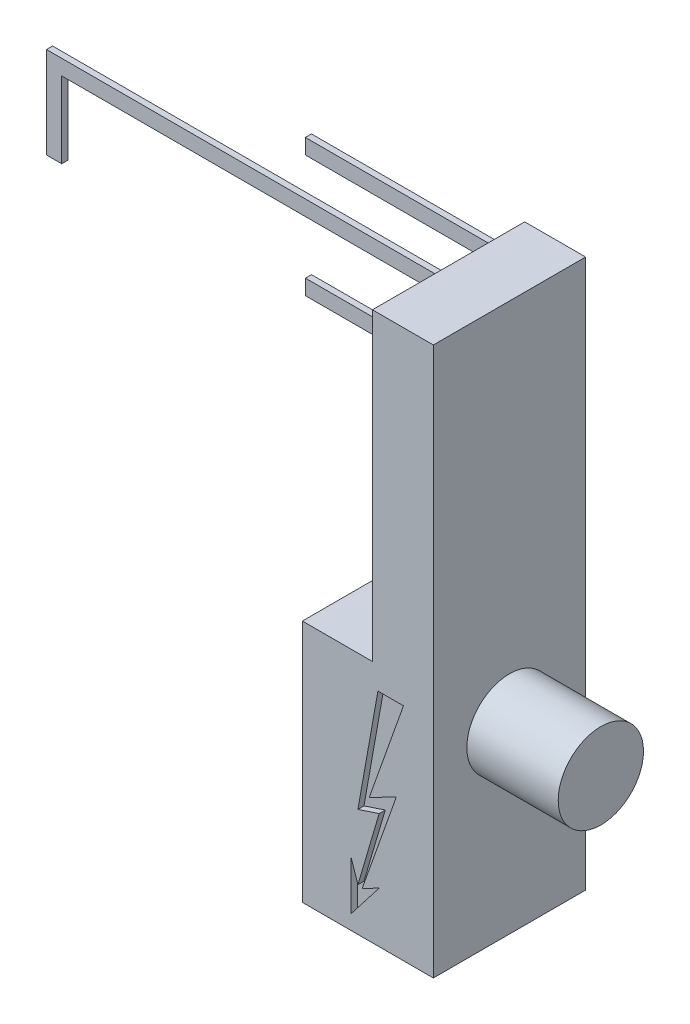
ISO-10303-21;
HEADER;
FILE_DESCRIPTION(('STEP AP214'),'2;1');
FILE_NAME('part.step','',(''),(''),'','','');
FILE_SCHEMA(('AUTOMOTIVE_DESIGN { 1 0 10303 214 1 1 1 1 }'));
ENDSEC;
DATA;
#1=APPLICATION_CONTEXT('core data for automotive mechanical design processes');
#2=APPLICATION_PROTOCOL_DEFINITION('international standard','automotive_design',2000,#1);
#3=PRODUCT_CONTEXT('',#1,'mechanical');
#4=PRODUCT('Part','Part','',(#3));
#5=PRODUCT_RELATED_PRODUCT_CATEGORY('part','',(#4));
#6=PRODUCT_DEFINITION_FORMATION('','',#4);
#7=PRODUCT_DEFINITION_CONTEXT('part definition',#1,'design');
#8=PRODUCT_DEFINITION('design','',#6,#7);
#9=PRODUCT_DEFINITION_SHAPE('','',#8);
#10=(LENGTH_UNIT() NAMED_UNIT(*) SI_UNIT(.MILLI.,.METRE.));
#11=(NAMED_UNIT(*) PLANE_ANGLE_UNIT() SI_UNIT($,.RADIAN.));
#12=(NAMED_UNIT(*) SI_UNIT($,.STERADIAN.) SOLID_ANGLE_UNIT());
#13=UNCERTAINTY_MEASURE_WITH_UNIT(LENGTH_MEASURE(1.E-05),#10,'distance_accuracy_value','');
#14=(GEOMETRIC_REPRESENTATION_CONTEXT(3) GLOBAL_UNCERTAINTY_ASSIGNED_CONTEXT((#13)) GLOBAL_UNIT_ASSIGNED_CONTEXT((#10,
#11,#12)) REPRESENTATION_CONTEXT('',''));
#15=CARTESIAN_POINT('',(0.,0.,0.));
#16=DIRECTION('',(0.,0.,1.));
#17=DIRECTION('',(1.,0.,0.));
#18=AXIS2_PLACEMENT_3D('',#15,#16,#17);
#19=CARTESIAN_POINT('',(-3.5,31.25,-11.5));
#20=DIRECTION('',(1.,0.,0.));
#21=DIRECTION('',(0.,1.,0.));
#22=AXIS2_PLACEMENT_3D('',#19,#20,#21);
#23=PLANE('',#22);
#24=DIRECTION('',(0.,-1.,0.));
#25=VECTOR('',#24,1.);
#26=CARTESIAN_POINT('',(-3.5,31.25,-12.5));
#27=LINE('',#26,#25);
#28=CARTESIAN_POINT('',(-3.5,31.25,-12.5));
#29=VERTEX_POINT('',#28);
#30=CARTESIAN_POINT('',(-3.5,28.75,-12.5));
#31=VERTEX_POINT('',#30);
#32=EDGE_CURVE('E135',#29,#31,#27,.T.);
#33=ORIENTED_EDGE('',*,*,#32,.F.);
#34=DIRECTION('',(0.,0.,-1.));
#35=VECTOR('',#34,1.);
#36=CARTESIAN_POINT('',(-3.5,31.25,-11.5));
#37=LINE('',#36,#35);
#38=CARTESIAN_POINT('',(-3.5,31.25,-11.5));
#39=VERTEX_POINT('',#38);
#40=EDGE_CURVE('E12',#39,#29,#37,.T.);
#41=ORIENTED_EDGE('',*,*,#40,.F.);
#42=DIRECTION('',(0.,-1.,0.));
#43=VECTOR('',#42,1.);
#44=CARTESIAN_POINT('',(-3.5,31.25,-11.5));
#45=LINE('',#44,#43);
#46=CARTESIAN_POINT('',(-3.5,28.75,-11.5));
#47=VERTEX_POINT('',#46);
#48=EDGE_CURVE('E147',#39,#47,#45,.T.);
#49=ORIENTED_EDGE('',*,*,#48,.T.);
#50=DIRECTION('',(0.,0.,-1.));
#51=VECTOR('',#50,1.);
#52=CARTESIAN_POINT('',(-3.5,28.75,-11.5));
#53=LINE('',#52,#51);
#54=EDGE_CURVE('E53',#47,#31,#53,.T.);
#55=ORIENTED_EDGE('',*,*,#54,.T.);
#56=EDGE_LOOP('',(#33,#41,#49,#55));
#57=FACE_BOUND('',#56,.T.);
#58=ADVANCED_FACE('F50',(#57),#23,.T.);
#59=CARTESIAN_POINT('',(-3.5,31.25,-11.5));
#60=DIRECTION('',(0.,1.,0.));
#61=DIRECTION('',(0.,0.,1.));
#62=AXIS2_PLACEMENT_3D('',#59,#60,#61);
#63=PLANE('',#62);
#64=DIRECTION('',(1.,0.,0.));
#65=VECTOR('',#64,1.);
#66=CARTESIAN_POINT('',(-3.5,31.25,-12.5));
#67=LINE('',#66,#65);
#68=CARTESIAN_POINT('',(-81.,31.25,-12.5));
#69=VERTEX_POINT('',#68);
#70=EDGE_CURVE('E87',#69,#29,#67,.T.);
#71=ORIENTED_EDGE('',*,*,#70,.F.);
#72=DIRECTION('',(0.,0.,-1.));
#73=VECTOR('',#72,1.);
#74=CARTESIAN_POINT('',(-81.,31.25,-11.5));
#75=LINE('',#74,#73);
#76=CARTESIAN_POINT('',(-81.,31.25,-11.5));
#77=VERTEX_POINT('',#76);
#78=EDGE_CURVE('E59',#77,#69,#75,.T.);
#79=ORIENTED_EDGE('',*,*,#78,.F.);
#80=DIRECTION('',(1.,0.,0.));
#81=VECTOR('',#80,1.);
#82=CARTESIAN_POINT('',(-78.5,31.25,-11.5));
#83=LINE('',#82,#81);
#84=EDGE_CURVE('E67',#77,#39,#83,.T.);
#85=ORIENTED_EDGE('',*,*,#84,.T.);
#86=ORIENTED_EDGE('',*,*,#40,.T.);
#87=EDGE_LOOP('',(#71,#79,#85,#86));
#88=FACE_BOUND('',#87,.T.);
#89=ADVANCED_FACE('F168',(#88),#63,.T.);
#90=CARTESIAN_POINT('',(-81.,31.25,-11.5));
#91=DIRECTION('',(-1.,0.,0.));
#92=DIRECTION('',(0.,0.,1.));
#93=AXIS2_PLACEMENT_3D('',#90,#91,#92);
#94=PLANE('',#93);
#95=DIRECTION('',(0.,1.,0.));
#96=VECTOR('',#95,1.);
#97=CARTESIAN_POINT('',(-81.,31.25,-12.5));
#98=LINE('',#97,#96);
#99=CARTESIAN_POINT('',(-81.,16.25,-12.5));
#100=VERTEX_POINT('',#99);
#101=EDGE_CURVE('E112',#100,#69,#98,.T.);
#102=ORIENTED_EDGE('',*,*,#101,.F.);
#103=DIRECTION('',(0.,0.,-1.));
#104=VECTOR('',#103,1.);
#105=CARTESIAN_POINT('',(-81.,16.25,-11.5));
#106=LINE('',#105,#104);
#107=CARTESIAN_POINT('',(-81.,16.25,-11.5));
#108=VERTEX_POINT('',#107);
#109=EDGE_CURVE('E107',#108,#100,#106,.T.);
#110=ORIENTED_EDGE('',*,*,#109,.F.);
#111=DIRECTION('',(0.,1.,0.));
#112=VECTOR('',#111,1.);
#113=CARTESIAN_POINT('',(-81.,31.25,-11.5));
#114=LINE('',#113,#112);
#115=EDGE_CURVE('E110',#108,#77,#114,.T.);
#116=ORIENTED_EDGE('',*,*,#115,.T.);
#117=ORIENTED_EDGE('',*,*,#78,.T.);
#118=EDGE_LOOP('',(#102,#110,#116,#117));
#119=FACE_BOUND('',#118,.T.);
#120=ADVANCED_FACE('F109',(#119),#94,.T.);
#121=CARTESIAN_POINT('',(-78.5,16.25,-11.5));
#122=DIRECTION('',(0.,-1.,0.));
#123=DIRECTION('',(0.,0.,-1.));
#124=AXIS2_PLACEMENT_3D('',#121,#122,#123);
#125=PLANE('',#124);
#126=DIRECTION('',(-1.,0.,0.));
#127=VECTOR('',#126,1.);
#128=CARTESIAN_POINT('',(-78.5,16.25,-12.5));
#129=LINE('',#128,#127);
#130=CARTESIAN_POINT('',(-78.5,16.25,-12.5));
#131=VERTEX_POINT('',#130);
#132=EDGE_CURVE('E144',#131,#100,#129,.T.);
#133=ORIENTED_EDGE('',*,*,#132,.F.);
#134=DIRECTION('',(0.,0.,-1.));
#135=VECTOR('',#134,1.);
#136=CARTESIAN_POINT('',(-78.5,16.25,-11.5));
#137=LINE('',#136,#135);
#138=CARTESIAN_POINT('',(-78.5,16.25,-11.5));
#139=VERTEX_POINT('',#138);
#140=EDGE_CURVE('E117',#139,#131,#137,.T.);
#141=ORIENTED_EDGE('',*,*,#140,.F.);
#142=DIRECTION('',(-1.,0.,0.));
#143=VECTOR('',#142,1.);
#144=CARTESIAN_POINT('',(-78.5,16.25,-11.5));
#145=LINE('',#144,#143);
#146=EDGE_CURVE('E124',#139,#108,#145,.T.);
#147=ORIENTED_EDGE('',*,*,#146,.T.);
#148=ORIENTED_EDGE('',*,*,#109,.T.);
#149=EDGE_LOOP('',(#133,#141,#147,#148));
#150=FACE_BOUND('',#149,.T.);
#151=ADVANCED_FACE('F127',(#150),#125,.T.);
#152=CARTESIAN_POINT('',(-78.5,28.75,-11.5));
#153=DIRECTION('',(1.,0.,0.));
#154=DIRECTION('',(0.,0.,-1.));
#155=AXIS2_PLACEMENT_3D('',#152,#153,#154);
#156=PLANE('',#155);
#157=DIRECTION('',(0.,-1.,0.));
#158=VECTOR('',#157,1.);
#159=CARTESIAN_POINT('',(-78.5,28.75,-12.5));
#160=LINE('',#159,#158);
#161=CARTESIAN_POINT('',(-78.5,28.75,-12.5));
#162=VERTEX_POINT('',#161);
#163=EDGE_CURVE('E141',#162,#131,#160,.T.);
#164=ORIENTED_EDGE('',*,*,#163,.F.);
#165=DIRECTION('',(0.,0.,-1.));
#166=VECTOR('',#165,1.);
#167=CARTESIAN_POINT('',(-78.5,28.75,-11.5));
#168=LINE('',#167,#166);
#169=CARTESIAN_POINT('',(-78.5,28.75,-11.5));
#170=VERTEX_POINT('',#169);
#171=EDGE_CURVE('E150',#170,#162,#168,.T.);
#172=ORIENTED_EDGE('',*,*,#171,.F.);
#173=DIRECTION('',(0.,-1.,0.));
#174=VECTOR('',#173,1.);
#175=CARTESIAN_POINT('',(-78.5,28.75,-11.5));
#176=LINE('',#175,#174);
#177=EDGE_CURVE('E128',#170,#139,#176,.T.);
#178=ORIENTED_EDGE('',*,*,#177,.T.);
#179=ORIENTED_EDGE('',*,*,#140,.T.);
#180=EDGE_LOOP('',(#164,#172,#178,#179));
#181=FACE_BOUND('',#180,.T.);
#182=ADVANCED_FACE('F158',(#181),#156,.T.);
#183=CARTESIAN_POINT('',(-3.5,28.75,-11.5));
#184=DIRECTION('',(0.,-1.,0.));
#185=DIRECTION('',(0.,0.,-1.));
#186=AXIS2_PLACEMENT_3D('',#183,#184,#185);
#187=PLANE('',#186);
#188=DIRECTION('',(-1.,0.,0.));
#189=VECTOR('',#188,1.);
#190=CARTESIAN_POINT('',(-3.5,28.75,-12.5));
#191=LINE('',#190,#189);
#192=EDGE_CURVE('E138',#31,#162,#191,.T.);
#193=ORIENTED_EDGE('',*,*,#192,.F.);
#194=ORIENTED_EDGE('',*,*,#54,.F.);
#195=DIRECTION('',(-1.,0.,0.));
#196=VECTOR('',#195,1.);
#197=CARTESIAN_POINT('',(-3.5,28.75,-11.5));
#198=LINE('',#197,#196);
#199=EDGE_CURVE('E130',#47,#170,#198,.T.);
#200=ORIENTED_EDGE('',*,*,#199,.T.);
#201=ORIENTED_EDGE('',*,*,#171,.T.);
#202=EDGE_LOOP('',(#193,#194,#200,#201));
#203=FACE_BOUND('',#202,.T.);
#204=ADVANCED_FACE('F154',(#203),#187,.T.);
#205=CARTESIAN_POINT('',(0.,0.,-11.5));
#206=DIRECTION('',(0.,0.,-1.));
#207=DIRECTION('',(-1.,0.,0.));
#208=AXIS2_PLACEMENT_3D('',#205,#206,#207);
#209=PLANE('',#208);
#210=ORIENTED_EDGE('',*,*,#48,.F.);
#211=ORIENTED_EDGE('',*,*,#84,.F.);
#212=ORIENTED_EDGE('',*,*,#115,.F.);
#213=ORIENTED_EDGE('',*,*,#146,.F.);
#214=ORIENTED_EDGE('',*,*,#177,.F.);
#215=ORIENTED_EDGE('',*,*,#199,.F.);
#216=EDGE_LOOP('',(#210,#211,#212,#213,#214,#215));
#217=FACE_BOUND('',#216,.T.);
#218=ADVANCED_FACE('F122',(#217),#209,.F.);
#219=CARTESIAN_POINT('',(0.,0.,-12.5));
#220=DIRECTION('',(0.,0.,-1.));
#221=DIRECTION('',(-1.,0.,0.));
#222=AXIS2_PLACEMENT_3D('',#219,#220,#221);
#223=PLANE('',#222);
#224=ORIENTED_EDGE('',*,*,#32,.T.);
#225=ORIENTED_EDGE('',*,*,#192,.T.);
#226=ORIENTED_EDGE('',*,*,#163,.T.);
#227=ORIENTED_EDGE('',*,*,#132,.T.);
#228=ORIENTED_EDGE('',*,*,#101,.T.);
#229=ORIENTED_EDGE('',*,*,#70,.T.);
#230=EDGE_LOOP('',(#224,#225,#226,#227,#228,#229));
#231=FACE_BOUND('',#230,.T.);
#232=ADVANCED_FACE('F156',(#231),#223,.T.);
#233=CLOSED_SHELL('',(#58,#89,#120,#151,#182,#204,#218,#232));
#234=MANIFOLD_SOLID_BREP('B2',#233);
#235=CARTESIAN_POINT('',(-3.5,17.5,-11.5));
#236=DIRECTION('',(1.,0.,0.));
#237=DIRECTION('',(0.,1.,0.));
#238=AXIS2_PLACEMENT_3D('',#235,#236,#237);
#239=PLANE('',#238);
#240=DIRECTION('',(0.,-1.,0.));
#241=VECTOR('',#240,1.);
#242=CARTESIAN_POINT('',(-3.5,17.5,-12.5));
#243=LINE('',#242,#241);
#244=CARTESIAN_POINT('',(-3.5,20.,-12.5));
#245=VERTEX_POINT('',#244);
#246=CARTESIAN_POINT('',(-3.5,17.5,-12.5));
#247=VERTEX_POINT('',#246);
#248=EDGE_CURVE('E303',#245,#247,#243,.T.);
#249=ORIENTED_EDGE('',*,*,#248,.F.);
#250=DIRECTION('',(0.,0.,-1.));
#251=VECTOR('',#250,1.);
#252=CARTESIAN_POINT('',(-3.5,20.,-11.5));
#253=LINE('',#252,#251);
#254=CARTESIAN_POINT('',(-3.5,20.,-11.5));
#255=VERTEX_POINT('',#254);
#256=EDGE_CURVE('E48',#255,#245,#253,.T.);
#257=ORIENTED_EDGE('',*,*,#256,.F.);
#258=DIRECTION('',(0.,-1.,0.));
#259=VECTOR('',#258,1.);
#260=CARTESIAN_POINT('',(-3.5,17.5,-11.5));
#261=LINE('',#260,#259);
#262=CARTESIAN_POINT('',(-3.5,17.5,-11.5));
#263=VERTEX_POINT('',#262);
#264=EDGE_CURVE('E297',#255,#263,#261,.T.);
#265=ORIENTED_EDGE('',*,*,#264,.T.);
#266=DIRECTION('',(0.,0.,-1.));
#267=VECTOR('',#266,1.);
#268=CARTESIAN_POINT('',(-3.5,17.5,-11.5));
#269=LINE('',#268,#267);
#270=EDGE_CURVE('E242',#263,#247,#269,.T.);
#271=ORIENTED_EDGE('',*,*,#270,.T.);
#272=EDGE_LOOP('',(#249,#257,#265,#271));
#273=FACE_BOUND('',#272,.T.);
#274=ADVANCED_FACE('F239',(#273),#239,.T.);
#275=CARTESIAN_POINT('',(-3.5,20.,-11.5));
#276=DIRECTION('',(0.,1.,0.));
#277=DIRECTION('',(-1.,0.,0.));
#278=AXIS2_PLACEMENT_3D('',#275,#276,#277);
#279=PLANE('',#278);
#280=DIRECTION('',(1.,0.,0.));
#281=VECTOR('',#280,1.);
#282=CARTESIAN_POINT('',(-3.5,20.,-12.5));
#283=LINE('',#282,#281);
#284=CARTESIAN_POINT('',(-38.5,20.,-12.5));
#285=VERTEX_POINT('',#284);
#286=EDGE_CURVE('E299',#285,#245,#283,.T.);
#287=ORIENTED_EDGE('',*,*,#286,.F.);
#288=DIRECTION('',(0.,0.,-1.));
#289=VECTOR('',#288,1.);
#290=CARTESIAN_POINT('',(-38.5,20.,-11.5));
#291=LINE('',#290,#289);
#292=CARTESIAN_POINT('',(-38.5,20.,-11.5));
#293=VERTEX_POINT('',#292);
#294=EDGE_CURVE('E248',#293,#285,#291,.T.);
#295=ORIENTED_EDGE('',*,*,#294,.F.);
#296=DIRECTION('',(1.,0.,0.));
#297=VECTOR('',#296,1.);
#298=CARTESIAN_POINT('',(-3.5,20.,-11.5));
#299=LINE('',#298,#297);
#300=EDGE_CURVE('E294',#293,#255,#299,.T.);
#301=ORIENTED_EDGE('',*,*,#300,.T.);
#302=ORIENTED_EDGE('',*,*,#256,.T.);
#303=EDGE_LOOP('',(#287,#295,#301,#302));
#304=FACE_BOUND('',#303,.T.);
#305=ADVANCED_FACE('F313',(#304),#279,.T.);
#306=CARTESIAN_POINT('',(-38.5,20.,-11.5));
#307=DIRECTION('',(-1.,0.,0.));
#308=DIRECTION('',(0.,0.,1.));
#309=AXIS2_PLACEMENT_3D('',#306,#307,#308);
#310=PLANE('',#309);
#311=DIRECTION('',(0.,1.,0.));
#312=VECTOR('',#311,1.);
#313=CARTESIAN_POINT('',(-38.5,20.,-12.5));
#314=LINE('',#313,#312);
#315=CARTESIAN_POINT('',(-38.5,17.5,-12.5));
#316=VERTEX_POINT('',#315);
#317=EDGE_CURVE('E289',#316,#285,#314,.T.);
#318=ORIENTED_EDGE('',*,*,#317,.F.);
#319=DIRECTION('',(0.,0.,-1.));
#320=VECTOR('',#319,1.);
#321=CARTESIAN_POINT('',(-38.5,17.5,-11.5));
#322=LINE('',#321,#320);
#323=CARTESIAN_POINT('',(-38.5,17.5,-11.5));
#324=VERTEX_POINT('',#323);
#325=EDGE_CURVE('E284',#324,#316,#322,.T.);
#326=ORIENTED_EDGE('',*,*,#325,.F.);
#327=DIRECTION('',(0.,1.,0.));
#328=VECTOR('',#327,1.);
#329=CARTESIAN_POINT('',(-38.5,20.,-11.5));
#330=LINE('',#329,#328);
#331=EDGE_CURVE('E287',#324,#293,#330,.T.);
#332=ORIENTED_EDGE('',*,*,#331,.T.);
#333=ORIENTED_EDGE('',*,*,#294,.T.);
#334=EDGE_LOOP('',(#318,#326,#332,#333));
#335=FACE_BOUND('',#334,.T.);
#336=ADVANCED_FACE('F286',(#335),#310,.T.);
#337=CARTESIAN_POINT('',(-38.5,17.5,-11.5));
#338=DIRECTION('',(0.,-1.,0.));
#339=DIRECTION('',(1.,0.,0.));
#340=AXIS2_PLACEMENT_3D('',#337,#338,#339);
#341=PLANE('',#340);
#342=DIRECTION('',(-1.,0.,0.));
#343=VECTOR('',#342,1.);
#344=CARTESIAN_POINT('',(-38.5,17.5,-12.5));
#345=LINE('',#344,#343);
#346=EDGE_CURVE('E306',#247,#316,#345,.T.);
#347=ORIENTED_EDGE('',*,*,#346,.F.);
#348=ORIENTED_EDGE('',*,*,#270,.F.);
#349=DIRECTION('',(-1.,0.,0.));
#350=VECTOR('',#349,1.);
#351=CARTESIAN_POINT('',(-38.5,17.5,-11.5));
#352=LINE('',#351,#350);
#353=EDGE_CURVE('E293',#263,#324,#352,.T.);
#354=ORIENTED_EDGE('',*,*,#353,.T.);
#355=ORIENTED_EDGE('',*,*,#325,.T.);
#356=EDGE_LOOP('',(#347,#348,#354,#355));
#357=FACE_BOUND('',#356,.T.);
#358=ADVANCED_FACE('F296',(#357),#341,.T.);
#359=CARTESIAN_POINT('',(0.,0.,-11.5));
#360=DIRECTION('',(0.,0.,1.));
#361=DIRECTION('',(1.,0.,0.));
#362=AXIS2_PLACEMENT_3D('',#359,#360,#361);
#363=PLANE('',#362);
#364=ORIENTED_EDGE('',*,*,#264,.F.);
#365=ORIENTED_EDGE('',*,*,#300,.F.);
#366=ORIENTED_EDGE('',*,*,#331,.F.);
#367=ORIENTED_EDGE('',*,*,#353,.F.);
#368=EDGE_LOOP('',(#364,#365,#366,#367));
#369=FACE_BOUND('',#368,.T.);
#370=ADVANCED_FACE('F292',(#369),#363,.T.);
#371=CARTESIAN_POINT('',(0.,0.,-12.5));
#372=DIRECTION('',(0.,0.,1.));
#373=DIRECTION('',(1.,0.,0.));
#374=AXIS2_PLACEMENT_3D('',#371,#372,#373);
#375=PLANE('',#374);
#376=ORIENTED_EDGE('',*,*,#248,.T.);
#377=ORIENTED_EDGE('',*,*,#346,.T.);
#378=ORIENTED_EDGE('',*,*,#317,.T.);
#379=ORIENTED_EDGE('',*,*,#286,.T.);
#380=EDGE_LOOP('',(#376,#377,#378,#379));
#381=FACE_BOUND('',#380,.T.);
#382=ADVANCED_FACE('F312',(#381),#375,.F.);
#383=CLOSED_SHELL('',(#274,#305,#336,#358,#370,#382));
#384=MANIFOLD_SOLID_BREP('B6',#383);
#385=CARTESIAN_POINT('',(-3.5,37.5,-11.5));
#386=DIRECTION('',(1.,0.,0.));
#387=DIRECTION('',(0.,0.,-1.));
#388=AXIS2_PLACEMENT_3D('',#385,#386,#387);
#389=PLANE('',#388);
#390=DIRECTION('',(0.,-1.,0.));
#391=VECTOR('',#390,1.);
#392=CARTESIAN_POINT('',(-3.5,37.5,-12.5));
#393=LINE('',#392,#391);
#394=CARTESIAN_POINT('',(-3.5,40.,-12.5));
#395=VERTEX_POINT('',#394);
#396=CARTESIAN_POINT('',(-3.5,37.5,-12.5));
#397=VERTEX_POINT('',#396);
#398=EDGE_CURVE('E436',#395,#397,#393,.T.);
#399=ORIENTED_EDGE('',*,*,#398,.F.);
#400=DIRECTION('',(0.,0.,-1.));
#401=VECTOR('',#400,1.);
#402=CARTESIAN_POINT('',(-3.5,40.,-11.5));
#403=LINE('',#402,#401);
#404=CARTESIAN_POINT('',(-3.5,40.,-11.5));
#405=VERTEX_POINT('',#404);
#406=EDGE_CURVE('E237',#405,#395,#403,.T.);
#407=ORIENTED_EDGE('',*,*,#406,.F.);
#408=DIRECTION('',(0.,-1.,0.));
#409=VECTOR('',#408,1.);
#410=CARTESIAN_POINT('',(-3.5,37.5,-11.5));
#411=LINE('',#410,#409);
#412=CARTESIAN_POINT('',(-3.5,37.5,-11.5));
#413=VERTEX_POINT('',#412);
#414=EDGE_CURVE('E430',#405,#413,#411,.T.);
#415=ORIENTED_EDGE('',*,*,#414,.T.);
#416=DIRECTION('',(0.,0.,-1.));
#417=VECTOR('',#416,1.);
#418=CARTESIAN_POINT('',(-3.5,37.5,-11.5));
#419=LINE('',#418,#417);
#420=EDGE_CURVE('E375',#413,#397,#419,.T.);
#421=ORIENTED_EDGE('',*,*,#420,.T.);
#422=EDGE_LOOP('',(#399,#407,#415,#421));
#423=FACE_BOUND('',#422,.T.);
#424=ADVANCED_FACE('F372',(#423),#389,.T.);
#425=CARTESIAN_POINT('',(-3.5,40.,-11.5));
#426=DIRECTION('',(0.,1.,0.));
#427=DIRECTION('',(0.,0.,1.));
#428=AXIS2_PLACEMENT_3D('',#425,#426,#427);
#429=PLANE('',#428);
#430=DIRECTION('',(1.,0.,0.));
#431=VECTOR('',#430,1.);
#432=CARTESIAN_POINT('',(-3.5,40.,-12.5));
#433=LINE('',#432,#431);
#434=CARTESIAN_POINT('',(-38.5,40.,-12.5));
#435=VERTEX_POINT('',#434);
#436=EDGE_CURVE('E432',#435,#395,#433,.T.);
#437=ORIENTED_EDGE('',*,*,#436,.F.);
#438=DIRECTION('',(0.,0.,-1.));
#439=VECTOR('',#438,1.);
#440=CARTESIAN_POINT('',(-38.5,40.,-11.5));
#441=LINE('',#440,#439);
#442=CARTESIAN_POINT('',(-38.5,40.,-11.5));
#443=VERTEX_POINT('',#442);
#444=EDGE_CURVE('E381',#443,#435,#441,.T.);
#445=ORIENTED_EDGE('',*,*,#444,.F.);
#446=DIRECTION('',(1.,0.,0.));
#447=VECTOR('',#446,1.);
#448=CARTESIAN_POINT('',(-3.5,40.,-11.5));
#449=LINE('',#448,#447);
#450=EDGE_CURVE('E427',#443,#405,#449,.T.);
#451=ORIENTED_EDGE('',*,*,#450,.T.);
#452=ORIENTED_EDGE('',*,*,#406,.T.);
#453=EDGE_LOOP('',(#437,#445,#451,#452));
#454=FACE_BOUND('',#453,.T.);
#455=ADVANCED_FACE('F446',(#454),#429,.T.);
#456=CARTESIAN_POINT('',(-38.5,40.,-11.5));
#457=DIRECTION('',(-1.,0.,0.));
#458=DIRECTION('',(0.,-1.,0.));
#459=AXIS2_PLACEMENT_3D('',#456,#457,#458);
#460=PLANE('',#459);
#461=DIRECTION('',(0.,1.,0.));
#462=VECTOR('',#461,1.);
#463=CARTESIAN_POINT('',(-38.5,40.,-12.5));
#464=LINE('',#463,#462);
#465=CARTESIAN_POINT('',(-38.5,37.5,-12.5));
#466=VERTEX_POINT('',#465);
#467=EDGE_CURVE('E422',#466,#435,#464,.T.);
#468=ORIENTED_EDGE('',*,*,#467,.F.);
#469=DIRECTION('',(0.,0.,-1.));
#470=VECTOR('',#469,1.);
#471=CARTESIAN_POINT('',(-38.5,37.5,-11.5));
#472=LINE('',#471,#470);
#473=CARTESIAN_POINT('',(-38.5,37.5,-11.5));
#474=VERTEX_POINT('',#473);
#475=EDGE_CURVE('E417',#474,#466,#472,.T.);
#476=ORIENTED_EDGE('',*,*,#475,.F.);
#477=DIRECTION('',(0.,1.,0.));
#478=VECTOR('',#477,1.);
#479=CARTESIAN_POINT('',(-38.5,40.,-11.5));
#480=LINE('',#479,#478);
#481=EDGE_CURVE('E420',#474,#443,#480,.T.);
#482=ORIENTED_EDGE('',*,*,#481,.T.);
#483=ORIENTED_EDGE('',*,*,#444,.T.);
#484=EDGE_LOOP('',(#468,#476,#482,#483));
#485=FACE_BOUND('',#484,.T.);
#486=ADVANCED_FACE('F419',(#485),#460,.T.);
#487=CARTESIAN_POINT('',(-38.5,37.5,-11.5));
#488=DIRECTION('',(0.,-1.,0.));
#489=DIRECTION('',(1.,0.,0.));
#490=AXIS2_PLACEMENT_3D('',#487,#488,#489);
#491=PLANE('',#490);
#492=DIRECTION('',(-1.,0.,0.));
#493=VECTOR('',#492,1.);
#494=CARTESIAN_POINT('',(-38.5,37.5,-12.5));
#495=LINE('',#494,#493);
#496=EDGE_CURVE('E439',#397,#466,#495,.T.);
#497=ORIENTED_EDGE('',*,*,#496,.F.);
#498=ORIENTED_EDGE('',*,*,#420,.F.);
#499=DIRECTION('',(-1.,0.,0.));
#500=VECTOR('',#499,1.);
#501=CARTESIAN_POINT('',(-38.5,37.5,-11.5));
#502=LINE('',#501,#500);
#503=EDGE_CURVE('E426',#413,#474,#502,.T.);
#504=ORIENTED_EDGE('',*,*,#503,.T.);
#505=ORIENTED_EDGE('',*,*,#475,.T.);
#506=EDGE_LOOP('',(#497,#498,#504,#505));
#507=FACE_BOUND('',#506,.T.);
#508=ADVANCED_FACE('F429',(#507),#491,.T.);
#509=CARTESIAN_POINT('',(0.,0.,-11.5));
#510=DIRECTION('',(0.,0.,1.));
#511=DIRECTION('',(1.,0.,0.));
#512=AXIS2_PLACEMENT_3D('',#509,#510,#511);
#513=PLANE('',#512);
#514=ORIENTED_EDGE('',*,*,#414,.F.);
#515=ORIENTED_EDGE('',*,*,#450,.F.);
#516=ORIENTED_EDGE('',*,*,#481,.F.);
#517=ORIENTED_EDGE('',*,*,#503,.F.);
#518=EDGE_LOOP('',(#514,#515,#516,#517));
#519=FACE_BOUND('',#518,.T.);
#520=ADVANCED_FACE('F425',(#519),#513,.T.);
#521=CARTESIAN_POINT('',(0.,0.,-12.5));
#522=DIRECTION('',(0.,0.,1.));
#523=DIRECTION('',(1.,0.,0.));
#524=AXIS2_PLACEMENT_3D('',#521,#522,#523);
#525=PLANE('',#524);
#526=ORIENTED_EDGE('',*,*,#398,.T.);
#527=ORIENTED_EDGE('',*,*,#496,.T.);
#528=ORIENTED_EDGE('',*,*,#467,.T.);
#529=ORIENTED_EDGE('',*,*,#436,.T.);
#530=EDGE_LOOP('',(#526,#527,#528,#529));
#531=FACE_BOUND('',#530,.T.);
#532=ADVANCED_FACE('F445',(#531),#525,.F.);
#533=CLOSED_SHELL('',(#424,#455,#486,#508,#520,#532));
#534=MANIFOLD_SOLID_BREP('B42',#533);
#535=CARTESIAN_POINT('',(-3.5,-5.,12.5));
#536=DIRECTION('',(1.,0.,0.));
#537=DIRECTION('',(0.,0.,-1.));
#538=AXIS2_PLACEMENT_3D('',#535,#536,#537);
#539=PLANE('',#538);
#540=DIRECTION('',(0.,-1.,0.));
#541=VECTOR('',#540,1.);
#542=CARTESIAN_POINT('',(-3.5,-5.,-12.5));
#543=LINE('',#542,#541);
#544=CARTESIAN_POINT('',(-3.5,45.,-12.5));
#545=VERTEX_POINT('',#544);
#546=CARTESIAN_POINT('',(-3.5,-5.,-12.5));
#547=VERTEX_POINT('',#546);
#548=EDGE_CURVE('E598',#545,#547,#543,.T.);
#549=ORIENTED_EDGE('',*,*,#548,.T.);
#550=DIRECTION('',(0.,0.,-1.));
#551=VECTOR('',#550,1.);
#552=CARTESIAN_POINT('',(-3.5,-5.,12.5));
#553=LINE('',#552,#551);
#554=CARTESIAN_POINT('',(-3.5,-5.,12.5));
#555=VERTEX_POINT('',#554);
#556=EDGE_CURVE('E504',#555,#547,#553,.T.);
#557=ORIENTED_EDGE('',*,*,#556,.F.);
#558=DIRECTION('',(0.,-1.,0.));
#559=VECTOR('',#558,1.);
#560=CARTESIAN_POINT('',(-3.5,-5.,12.5));
#561=LINE('',#560,#559);
#562=CARTESIAN_POINT('',(-3.5,45.,12.5));
#563=VERTEX_POINT('',#562);
#564=EDGE_CURVE('E616',#563,#555,#561,.T.);
#565=ORIENTED_EDGE('',*,*,#564,.F.);
#566=DIRECTION('',(0.,0.,-1.));
#567=VECTOR('',#566,1.);
#568=CARTESIAN_POINT('',(-3.5,45.,12.5));
#569=LINE('',#568,#567);
#570=EDGE_CURVE('E594',#563,#545,#569,.T.);
#571=ORIENTED_EDGE('',*,*,#570,.T.);
#572=EDGE_LOOP('',(#549,#557,#565,#571));
#573=FACE_BOUND('',#572,.T.);
#574=ADVANCED_FACE('F496',(#573),#539,.F.);
#575=CARTESIAN_POINT('',(-3.5,-5.,12.5));
#576=DIRECTION('',(0.,-1.,0.));
#577=DIRECTION('',(1.,0.,0.));
#578=AXIS2_PLACEMENT_3D('',#575,#576,#577);
#579=PLANE('',#578);
#580=DIRECTION('',(-1.,0.,0.));
#581=VECTOR('',#580,1.);
#582=CARTESIAN_POINT('',(-3.5,-5.,-12.5));
#583=LINE('',#582,#581);
#584=CARTESIAN_POINT('',(-15.,-5.,-12.5));
#585=VERTEX_POINT('',#584);
#586=EDGE_CURVE('E602',#547,#585,#583,.T.);
#587=ORIENTED_EDGE('',*,*,#586,.T.);
#588=DIRECTION('',(0.,0.,-1.));
#589=VECTOR('',#588,1.);
#590=CARTESIAN_POINT('',(-15.,-5.,12.5));
#591=LINE('',#590,#589);
#592=CARTESIAN_POINT('',(-15.,-5.,12.5));
#593=VERTEX_POINT('',#592);
#594=EDGE_CURVE('E623',#593,#585,#591,.T.);
#595=ORIENTED_EDGE('',*,*,#594,.F.);
#596=DIRECTION('',(-1.,0.,0.));
#597=VECTOR('',#596,1.);
#598=CARTESIAN_POINT('',(-3.5,-5.,12.5));
#599=LINE('',#598,#597);
#600=EDGE_CURVE('E556',#555,#593,#599,.T.);
#601=ORIENTED_EDGE('',*,*,#600,.F.);
#602=ORIENTED_EDGE('',*,*,#556,.T.);
#603=EDGE_LOOP('',(#587,#595,#601,#602));
#604=FACE_BOUND('',#603,.T.);
#605=ADVANCED_FACE('F628',(#604),#579,.F.);
#606=CARTESIAN_POINT('',(-15.,-45.,12.5));
#607=DIRECTION('',(1.,0.,0.));
#608=DIRECTION('',(0.,0.,-1.));
#609=AXIS2_PLACEMENT_3D('',#606,#607,#608);
#610=PLANE('',#609);
#611=DIRECTION('',(0.,-1.,0.));
#612=VECTOR('',#611,1.);
#613=CARTESIAN_POINT('',(-15.,-45.,-12.5));
#614=LINE('',#613,#612);
#615=CARTESIAN_POINT('',(-15.,-45.,-12.5));
#616=VERTEX_POINT('',#615);
#617=EDGE_CURVE('E606',#585,#616,#614,.T.);
#618=ORIENTED_EDGE('',*,*,#617,.T.);
#619=DIRECTION('',(0.,0.,-1.));
#620=VECTOR('',#619,1.);
#621=CARTESIAN_POINT('',(-15.,-45.,12.5));
#622=LINE('',#621,#620);
#623=CARTESIAN_POINT('',(-15.,-45.,12.5));
#624=VERTEX_POINT('',#623);
#625=EDGE_CURVE('E587',#624,#616,#622,.T.);
#626=ORIENTED_EDGE('',*,*,#625,.F.);
#627=DIRECTION('',(0.,-1.,0.));
#628=VECTOR('',#627,1.);
#629=CARTESIAN_POINT('',(-15.,-45.,12.5));
#630=LINE('',#629,#628);
#631=EDGE_CURVE('E573',#593,#624,#630,.T.);
#632=ORIENTED_EDGE('',*,*,#631,.F.);
#633=ORIENTED_EDGE('',*,*,#594,.T.);
#634=EDGE_LOOP('',(#618,#626,#632,#633));
#635=FACE_BOUND('',#634,.T.);
#636=ADVANCED_FACE('F636',(#635),#610,.F.);
#637=CARTESIAN_POINT('',(-15.,-45.,12.5));
#638=DIRECTION('',(0.,1.,0.));
#639=DIRECTION('',(0.,0.,1.));
#640=AXIS2_PLACEMENT_3D('',#637,#638,#639);
#641=PLANE('',#640);
#642=DIRECTION('',(1.,0.,0.));
#643=VECTOR('',#642,1.);
#644=CARTESIAN_POINT('',(-15.,-45.,-12.5));
#645=LINE('',#644,#643);
#646=CARTESIAN_POINT('',(6.5,-45.,-12.5));
#647=VERTEX_POINT('',#646);
#648=EDGE_CURVE('E583',#616,#647,#645,.T.);
#649=ORIENTED_EDGE('',*,*,#648,.T.);
#650=DIRECTION('',(0.,0.,-1.));
#651=VECTOR('',#650,1.);
#652=CARTESIAN_POINT('',(6.5,-45.,12.5));
#653=LINE('',#652,#651);
#654=CARTESIAN_POINT('',(6.5,-45.,12.5));
#655=VERTEX_POINT('',#654);
#656=EDGE_CURVE('E580',#655,#647,#653,.T.);
#657=ORIENTED_EDGE('',*,*,#656,.F.);
#658=DIRECTION('',(1.,0.,0.));
#659=VECTOR('',#658,1.);
#660=CARTESIAN_POINT('',(-15.,-45.,12.5));
#661=LINE('',#660,#659);
#662=EDGE_CURVE('E566',#624,#655,#661,.T.);
#663=ORIENTED_EDGE('',*,*,#662,.F.);
#664=ORIENTED_EDGE('',*,*,#625,.T.);
#665=EDGE_LOOP('',(#649,#657,#663,#664));
#666=FACE_BOUND('',#665,.T.);
#667=ADVANCED_FACE('F581',(#666),#641,.F.);
#668=CARTESIAN_POINT('',(6.5,-45.,12.5));
#669=DIRECTION('',(-1.,0.,0.));
#670=DIRECTION('',(0.,0.,1.));
#671=AXIS2_PLACEMENT_3D('',#668,#669,#670);
#672=PLANE('',#671);
#673=CARTESIAN_POINT('',(6.5,-15.,0.));
#674=DIRECTION('',(-1.,0.,0.));
#675=DIRECTION('',(0.,0.,1.));
#676=AXIS2_PLACEMENT_3D('',#673,#674,#675);
#677=CIRCLE('',#676,7.);
#678=CARTESIAN_POINT('',(6.5,-15.,7.));
#679=VERTEX_POINT('',#678);
#680=EDGE_CURVE('E370',#679,#679,#677,.F.);
#681=ORIENTED_EDGE('',*,*,#680,.F.);
#682=EDGE_LOOP('',(#681));
#683=FACE_BOUND('',#682,.T.);
#684=DIRECTION('',(0.,1.,0.));
#685=VECTOR('',#684,1.);
#686=CARTESIAN_POINT('',(6.5,-45.,-12.5));
#687=LINE('',#686,#685);
#688=CARTESIAN_POINT('',(6.5,45.,-12.5));
#689=VERTEX_POINT('',#688);
#690=EDGE_CURVE('E611',#647,#689,#687,.T.);
#691=ORIENTED_EDGE('',*,*,#690,.T.);
#692=DIRECTION('',(0.,0.,-1.));
#693=VECTOR('',#692,1.);
#694=CARTESIAN_POINT('',(6.5,45.,12.5));
#695=LINE('',#694,#693);
#696=CARTESIAN_POINT('',(6.5,45.,12.5));
#697=VERTEX_POINT('',#696);
#698=EDGE_CURVE('E588',#697,#689,#695,.T.);
#699=ORIENTED_EDGE('',*,*,#698,.F.);
#700=DIRECTION('',(0.,1.,0.));
#701=VECTOR('',#700,1.);
#702=CARTESIAN_POINT('',(6.5,-45.,12.5));
#703=LINE('',#702,#701);
#704=EDGE_CURVE('E570',#655,#697,#703,.T.);
#705=ORIENTED_EDGE('',*,*,#704,.F.);
#706=ORIENTED_EDGE('',*,*,#656,.T.);
#707=EDGE_LOOP('',(#691,#699,#705,#706));
#708=FACE_BOUND('',#707,.T.);
#709=ADVANCED_FACE('F590',(#683,#708),#672,.F.);
#710=CARTESIAN_POINT('',(6.5,45.,12.5));
#711=DIRECTION('',(0.,-1.,0.));
#712=DIRECTION('',(1.,0.,0.));
#713=AXIS2_PLACEMENT_3D('',#710,#711,#712);
#714=PLANE('',#713);
#715=DIRECTION('',(-1.,0.,0.));
#716=VECTOR('',#715,1.);
#717=CARTESIAN_POINT('',(6.5,45.,-12.5));
#718=LINE('',#717,#716);
#719=EDGE_CURVE('E547',#689,#545,#718,.T.);
#720=ORIENTED_EDGE('',*,*,#719,.T.);
#721=ORIENTED_EDGE('',*,*,#570,.F.);
#722=DIRECTION('',(-1.,0.,0.));
#723=VECTOR('',#722,1.);
#724=CARTESIAN_POINT('',(6.5,45.,12.5));
#725=LINE('',#724,#723);
#726=EDGE_CURVE('E520',#697,#563,#725,.T.);
#727=ORIENTED_EDGE('',*,*,#726,.F.);
#728=ORIENTED_EDGE('',*,*,#698,.T.);
#729=EDGE_LOOP('',(#720,#721,#727,#728));
#730=FACE_BOUND('',#729,.T.);
#731=ADVANCED_FACE('F785',(#730),#714,.F.);
#732=CARTESIAN_POINT('',(0.,0.,12.5));
#733=DIRECTION('',(0.,0.,1.));
#734=DIRECTION('',(1.,0.,0.));
#735=AXIS2_PLACEMENT_3D('',#732,#733,#734);
#736=PLANE('',#735);
#737=DIRECTION('',(0.334377178520095,0.942439336235994,0.));
#738=VECTOR('',#737,1.);
#739=CARTESIAN_POINT('',(-4.02883827757406,-24.6161726459966,12.5));
#740=LINE('',#739,#738);
#741=CARTESIAN_POINT('',(-4.02883827757406,-24.6161726459966,12.5));
#742=VERTEX_POINT('',#741);
#743=CARTESIAN_POINT('',(1.59908691795539,-8.75391162347336,12.5));
#744=VERTEX_POINT('',#743);
#745=EDGE_CURVE('E511',#742,#744,#740,.T.);
#746=ORIENTED_EDGE('',*,*,#745,.F.);
#747=DIRECTION('',(-0.885968643465612,-0.46374514854142,0.));
#748=VECTOR('',#747,1.);
#749=CARTESIAN_POINT('',(0.436139273390691,-22.2790564366614,12.5));
#750=LINE('',#749,#748);
#751=CARTESIAN_POINT('',(0.436139273390691,-22.2790564366614,12.5));
#752=VERTEX_POINT('',#751);
#753=EDGE_CURVE('E685',#752,#742,#750,.T.);
#754=ORIENTED_EDGE('',*,*,#753,.F.);
#755=DIRECTION('',(0.334377178520095,0.942439336235994,0.));
#756=VECTOR('',#755,1.);
#757=CARTESIAN_POINT('',(-5.18629684849494,-38.1258465501222,12.5));
#758=LINE('',#757,#756);
#759=CARTESIAN_POINT('',(-5.18629684849494,-38.1258465501222,12.5));
#760=VERTEX_POINT('',#759);
#761=EDGE_CURVE('E690',#760,#752,#758,.T.);
#762=ORIENTED_EDGE('',*,*,#761,.F.);
#763=DIRECTION('',(-0.885968643465612,-0.46374514854142,0.));
#764=VECTOR('',#763,1.);
#765=CARTESIAN_POINT('',(-2.38769870262579,-36.6609681682112,12.5));
#766=LINE('',#765,#764);
#767=CARTESIAN_POINT('',(-2.38769870262579,-36.6609681682112,12.5));
#768=VERTEX_POINT('',#767);
#769=EDGE_CURVE('E694',#768,#760,#766,.T.);
#770=ORIENTED_EDGE('',*,*,#769,.F.);
#771=DIRECTION('',(0.612303075014752,0.790623136726645,0.));
#772=VECTOR('',#771,1.);
#773=CARTESIAN_POINT('',(-6.98497547831003,-42.5971026302249,12.5));
#774=LINE('',#773,#772);
#775=CARTESIAN_POINT('',(-6.98497547831003,-42.5971026302249,12.5));
#776=VERTEX_POINT('',#775);
#777=EDGE_CURVE('E698',#776,#768,#774,.T.);
#778=ORIENTED_EDGE('',*,*,#777,.F.);
#779=DIRECTION('',(0.,-1.,0.));
#780=VECTOR('',#779,1.);
#781=CARTESIAN_POINT('',(-6.98497547831003,-34.6112267999807,12.5));
#782=LINE('',#781,#780);
#783=CARTESIAN_POINT('',(-6.98497547831003,-34.6112267999807,12.5));
#784=VERTEX_POINT('',#783);
#785=EDGE_CURVE('E702',#784,#776,#782,.T.);
#786=ORIENTED_EDGE('',*,*,#785,.F.);
#787=DIRECTION('',(-0.316227766016841,0.948683298050513,0.));
#788=VECTOR('',#787,1.);
#789=CARTESIAN_POINT('',(-5.88173779767652,-37.9209398418812,12.5));
#790=LINE('',#789,#788);
#791=CARTESIAN_POINT('',(-5.88173779767652,-37.9209398418812,12.5));
#792=VERTEX_POINT('',#791);
#793=EDGE_CURVE('E706',#792,#784,#790,.T.);
#794=ORIENTED_EDGE('',*,*,#793,.F.);
#795=DIRECTION('',(-0.282629976577568,-0.959229011414773,0.));
#796=VECTOR('',#795,1.);
#797=CARTESIAN_POINT('',(-2.38769870262618,-26.0623829132255,12.5));
#798=LINE('',#797,#796);
#799=CARTESIAN_POINT('',(-2.38769870262618,-26.0623829132255,12.5));
#800=VERTEX_POINT('',#799);
#801=EDGE_CURVE('E710',#800,#792,#798,.T.);
#802=ORIENTED_EDGE('',*,*,#801,.F.);
#803=DIRECTION('',(0.948683298050513,0.316227766016841,0.));
#804=VECTOR('',#803,1.);
#805=CARTESIAN_POINT('',(-5.88173779767655,-27.2270626115756,12.5));
#806=LINE('',#805,#804);
#807=CARTESIAN_POINT('',(-5.88173779767655,-27.2270626115756,12.5));
#808=VERTEX_POINT('',#807);
#809=EDGE_CURVE('E714',#808,#800,#806,.T.);
#810=ORIENTED_EDGE('',*,*,#809,.F.);
#811=DIRECTION('',(-0.175033334717495,-0.984562507785907,0.));
#812=VECTOR('',#811,1.);
#813=CARTESIAN_POINT('',(-2.59762206645837,-8.75391162347336,12.5));
#814=LINE('',#813,#812);
#815=CARTESIAN_POINT('',(-2.59762206645837,-8.75391162347336,12.5));
#816=VERTEX_POINT('',#815);
#817=EDGE_CURVE('E718',#816,#808,#814,.T.);
#818=ORIENTED_EDGE('',*,*,#817,.F.);
#819=DIRECTION('',(-1.,0.,0.));
#820=VECTOR('',#819,1.);
#821=CARTESIAN_POINT('',(1.59908691795539,-8.75391162347336,12.5));
#822=LINE('',#821,#820);
#823=EDGE_CURVE('E722',#744,#816,#822,.T.);
#824=ORIENTED_EDGE('',*,*,#823,.F.);
#825=EDGE_LOOP('',(#746,#754,#762,#770,#778,#786,#794,#802,#810,#818,#824));
#826=FACE_BOUND('',#825,.T.);
#827=ORIENTED_EDGE('',*,*,#564,.T.);
#828=ORIENTED_EDGE('',*,*,#600,.T.);
#829=ORIENTED_EDGE('',*,*,#631,.T.);
#830=ORIENTED_EDGE('',*,*,#662,.T.);
#831=ORIENTED_EDGE('',*,*,#704,.T.);
#832=ORIENTED_EDGE('',*,*,#726,.T.);
#833=EDGE_LOOP('',(#827,#828,#829,#830,#831,#832));
#834=FACE_BOUND('',#833,.T.);
#835=ADVANCED_FACE('F568',(#826,#834),#736,.T.);
#836=CARTESIAN_POINT('',(0.,0.,-12.5));
#837=DIRECTION('',(0.,0.,1.));
#838=DIRECTION('',(1.,0.,0.));
#839=AXIS2_PLACEMENT_3D('',#836,#837,#838);
#840=PLANE('',#839);
#841=ORIENTED_EDGE('',*,*,#548,.F.);
#842=ORIENTED_EDGE('',*,*,#719,.F.);
#843=ORIENTED_EDGE('',*,*,#690,.F.);
#844=ORIENTED_EDGE('',*,*,#648,.F.);
#845=ORIENTED_EDGE('',*,*,#617,.F.);
#846=ORIENTED_EDGE('',*,*,#586,.F.);
#847=EDGE_LOOP('',(#841,#842,#843,#844,#845,#846));
#848=FACE_BOUND('',#847,.T.);
#849=ADVANCED_FACE('F633',(#848),#840,.F.);
#850=CARTESIAN_POINT('',(-4.02883827757406,-24.6161726459966,11.5));
#851=DIRECTION('',(0.942439336235994,-0.334377178520095,0.));
#852=DIRECTION('',(0.334377178520095,0.942439336235994,0.));
#853=AXIS2_PLACEMENT_3D('',#850,#851,#852);
#854=PLANE('',#853);
#855=ORIENTED_EDGE('',*,*,#745,.T.);
#856=DIRECTION('',(0.,0.,1.));
#857=VECTOR('',#856,1.);
#858=CARTESIAN_POINT('',(1.59908691795539,-8.75391162347336,11.5));
#859=LINE('',#858,#857);
#860=CARTESIAN_POINT('',(1.59908691795539,-8.75391162347336,11.5));
#861=VERTEX_POINT('',#860);
#862=EDGE_CURVE('E643',#861,#744,#859,.T.);
#863=ORIENTED_EDGE('',*,*,#862,.F.);
#864=DIRECTION('',(0.334377178520095,0.942439336235994,0.));
#865=VECTOR('',#864,1.);
#866=CARTESIAN_POINT('',(-4.02883827757406,-24.6161726459966,11.5));
#867=LINE('',#866,#865);
#868=CARTESIAN_POINT('',(-4.02883827757406,-24.6161726459966,11.5));
#869=VERTEX_POINT('',#868);
#870=EDGE_CURVE('E689',#869,#861,#867,.T.);
#871=ORIENTED_EDGE('',*,*,#870,.F.);
#872=DIRECTION('',(0.,0.,1.));
#873=VECTOR('',#872,1.);
#874=CARTESIAN_POINT('',(-4.02883827757406,-24.6161726459966,11.5));
#875=LINE('',#874,#873);
#876=EDGE_CURVE('E603',#869,#742,#875,.T.);
#877=ORIENTED_EDGE('',*,*,#876,.T.);
#878=EDGE_LOOP('',(#855,#863,#871,#877));
#879=FACE_BOUND('',#878,.T.);
#880=ADVANCED_FACE('F825',(#879),#854,.F.);
#881=CARTESIAN_POINT('',(0.436139273390691,-22.2790564366614,11.5));
#882=DIRECTION('',(-0.46374514854142,0.885968643465612,0.));
#883=DIRECTION('',(-0.885968643465612,-0.46374514854142,0.));
#884=AXIS2_PLACEMENT_3D('',#881,#882,#883);
#885=PLANE('',#884);
#886=ORIENTED_EDGE('',*,*,#753,.T.);
#887=ORIENTED_EDGE('',*,*,#876,.F.);
#888=DIRECTION('',(-0.885968643465612,-0.46374514854142,0.));
#889=VECTOR('',#888,1.);
#890=CARTESIAN_POINT('',(0.436139273390691,-22.2790564366614,11.5));
#891=LINE('',#890,#889);
#892=CARTESIAN_POINT('',(0.436139273390691,-22.2790564366614,11.5));
#893=VERTEX_POINT('',#892);
#894=EDGE_CURVE('E647',#893,#869,#891,.T.);
#895=ORIENTED_EDGE('',*,*,#894,.F.);
#896=DIRECTION('',(0.,0.,1.));
#897=VECTOR('',#896,1.);
#898=CARTESIAN_POINT('',(0.436139273390691,-22.2790564366614,11.5));
#899=LINE('',#898,#897);
#900=EDGE_CURVE('E679',#893,#752,#899,.T.);
#901=ORIENTED_EDGE('',*,*,#900,.T.);
#902=EDGE_LOOP('',(#886,#887,#895,#901));
#903=FACE_BOUND('',#902,.T.);
#904=ADVANCED_FACE('F841',(#903),#885,.F.);
#905=CARTESIAN_POINT('',(-5.18629684849494,-38.1258465501222,11.5));
#906=DIRECTION('',(0.942439336235994,-0.334377178520095,0.));
#907=DIRECTION('',(0.334377178520095,0.942439336235994,0.));
#908=AXIS2_PLACEMENT_3D('',#905,#906,#907);
#909=PLANE('',#908);
#910=ORIENTED_EDGE('',*,*,#761,.T.);
#911=ORIENTED_EDGE('',*,*,#900,.F.);
#912=DIRECTION('',(0.334377178520095,0.942439336235994,0.));
#913=VECTOR('',#912,1.);
#914=CARTESIAN_POINT('',(-5.18629684849494,-38.1258465501222,11.5));
#915=LINE('',#914,#913);
#916=CARTESIAN_POINT('',(-5.18629684849494,-38.1258465501222,11.5));
#917=VERTEX_POINT('',#916);
#918=EDGE_CURVE('E732',#917,#893,#915,.T.);
#919=ORIENTED_EDGE('',*,*,#918,.F.);
#920=DIRECTION('',(0.,0.,1.));
#921=VECTOR('',#920,1.);
#922=CARTESIAN_POINT('',(-5.18629684849494,-38.1258465501222,11.5));
#923=LINE('',#922,#921);
#924=EDGE_CURVE('E675',#917,#760,#923,.T.);
#925=ORIENTED_EDGE('',*,*,#924,.T.);
#926=EDGE_LOOP('',(#910,#911,#919,#925));
#927=FACE_BOUND('',#926,.T.);
#928=ADVANCED_FACE('F850',(#927),#909,.F.);
#929=CARTESIAN_POINT('',(-2.38769870262579,-36.6609681682112,11.5));
#930=DIRECTION('',(-0.46374514854142,0.885968643465612,0.));
#931=DIRECTION('',(-0.885968643465612,-0.46374514854142,0.));
#932=AXIS2_PLACEMENT_3D('',#929,#930,#931);
#933=PLANE('',#932);
#934=ORIENTED_EDGE('',*,*,#769,.T.);
#935=ORIENTED_EDGE('',*,*,#924,.F.);
#936=DIRECTION('',(-0.885968643465612,-0.46374514854142,0.));
#937=VECTOR('',#936,1.);
#938=CARTESIAN_POINT('',(-2.38769870262579,-36.6609681682112,11.5));
#939=LINE('',#938,#937);
#940=CARTESIAN_POINT('',(-2.38769870262579,-36.6609681682112,11.5));
#941=VERTEX_POINT('',#940);
#942=EDGE_CURVE('E736',#941,#917,#939,.T.);
#943=ORIENTED_EDGE('',*,*,#942,.F.);
#944=DIRECTION('',(0.,0.,1.));
#945=VECTOR('',#944,1.);
#946=CARTESIAN_POINT('',(-2.38769870262579,-36.6609681682112,11.5));
#947=LINE('',#946,#945);
#948=EDGE_CURVE('E671',#941,#768,#947,.T.);
#949=ORIENTED_EDGE('',*,*,#948,.T.);
#950=EDGE_LOOP('',(#934,#935,#943,#949));
#951=FACE_BOUND('',#950,.T.);
#952=ADVANCED_FACE('F860',(#951),#933,.F.);
#953=CARTESIAN_POINT('',(-6.98497547831003,-42.5971026302249,11.5));
#954=DIRECTION('',(0.790623136726645,-0.612303075014752,0.));
#955=DIRECTION('',(0.612303075014752,0.790623136726645,0.));
#956=AXIS2_PLACEMENT_3D('',#953,#954,#955);
#957=PLANE('',#956);
#958=ORIENTED_EDGE('',*,*,#777,.T.);
#959=ORIENTED_EDGE('',*,*,#948,.F.);
#960=DIRECTION('',(0.612303075014752,0.790623136726645,0.));
#961=VECTOR('',#960,1.);
#962=CARTESIAN_POINT('',(-6.98497547831003,-42.5971026302249,11.5));
#963=LINE('',#962,#961);
#964=CARTESIAN_POINT('',(-6.98497547831003,-42.5971026302249,11.5));
#965=VERTEX_POINT('',#964);
#966=EDGE_CURVE('E740',#965,#941,#963,.T.);
#967=ORIENTED_EDGE('',*,*,#966,.F.);
#968=DIRECTION('',(0.,0.,1.));
#969=VECTOR('',#968,1.);
#970=CARTESIAN_POINT('',(-6.98497547831003,-42.5971026302249,11.5));
#971=LINE('',#970,#969);
#972=EDGE_CURVE('E667',#965,#776,#971,.T.);
#973=ORIENTED_EDGE('',*,*,#972,.T.);
#974=EDGE_LOOP('',(#958,#959,#967,#973));
#975=FACE_BOUND('',#974,.T.);
#976=ADVANCED_FACE('F870',(#975),#957,.F.);
#977=CARTESIAN_POINT('',(-6.98497547831003,-34.6112267999807,11.5));
#978=DIRECTION('',(-1.,0.,0.));
#979=DIRECTION('',(0.,-1.,0.));
#980=AXIS2_PLACEMENT_3D('',#977,#978,#979);
#981=PLANE('',#980);
#982=ORIENTED_EDGE('',*,*,#785,.T.);
#983=ORIENTED_EDGE('',*,*,#972,.F.);
#984=DIRECTION('',(0.,-1.,0.));
#985=VECTOR('',#984,1.);
#986=CARTESIAN_POINT('',(-6.98497547831003,-34.6112267999807,11.5));
#987=LINE('',#986,#985);
#988=CARTESIAN_POINT('',(-6.98497547831003,-34.6112267999807,11.5));
#989=VERTEX_POINT('',#988);
#990=EDGE_CURVE('E744',#989,#965,#987,.T.);
#991=ORIENTED_EDGE('',*,*,#990,.F.);
#992=DIRECTION('',(0.,0.,1.));
#993=VECTOR('',#992,1.);
#994=CARTESIAN_POINT('',(-6.98497547831003,-34.6112267999807,11.5));
#995=LINE('',#994,#993);
#996=EDGE_CURVE('E663',#989,#784,#995,.T.);
#997=ORIENTED_EDGE('',*,*,#996,.T.);
#998=EDGE_LOOP('',(#982,#983,#991,#997));
#999=FACE_BOUND('',#998,.T.);
#1000=ADVANCED_FACE('F880',(#999),#981,.F.);
#1001=CARTESIAN_POINT('',(-5.88173779767652,-37.9209398418812,11.5));
#1002=DIRECTION('',(0.948683298050513,0.316227766016841,0.));
#1003=DIRECTION('',(-0.316227766016841,0.948683298050513,0.));
#1004=AXIS2_PLACEMENT_3D('',#1001,#1002,#1003);
#1005=PLANE('',#1004);
#1006=ORIENTED_EDGE('',*,*,#793,.T.);
#1007=ORIENTED_EDGE('',*,*,#996,.F.);
#1008=DIRECTION('',(-0.316227766016841,0.948683298050513,0.));
#1009=VECTOR('',#1008,1.);
#1010=CARTESIAN_POINT('',(-5.88173779767652,-37.9209398418812,11.5));
#1011=LINE('',#1010,#1009);
#1012=CARTESIAN_POINT('',(-5.88173779767652,-37.9209398418812,11.5));
#1013=VERTEX_POINT('',#1012);
#1014=EDGE_CURVE('E748',#1013,#989,#1011,.T.);
#1015=ORIENTED_EDGE('',*,*,#1014,.F.);
#1016=DIRECTION('',(0.,0.,1.));
#1017=VECTOR('',#1016,1.);
#1018=CARTESIAN_POINT('',(-5.88173779767652,-37.9209398418812,11.5));
#1019=LINE('',#1018,#1017);
#1020=EDGE_CURVE('E659',#1013,#792,#1019,.T.);
#1021=ORIENTED_EDGE('',*,*,#1020,.T.);
#1022=EDGE_LOOP('',(#1006,#1007,#1015,#1021));
#1023=FACE_BOUND('',#1022,.T.);
#1024=ADVANCED_FACE('F890',(#1023),#1005,.F.);
#1025=CARTESIAN_POINT('',(-2.38769870262618,-26.0623829132255,11.5));
#1026=DIRECTION('',(-0.959229011414773,0.282629976577568,0.));
#1027=DIRECTION('',(-0.282629976577568,-0.959229011414774,0.));
#1028=AXIS2_PLACEMENT_3D('',#1025,#1026,#1027);
#1029=PLANE('',#1028);
#1030=ORIENTED_EDGE('',*,*,#801,.T.);
#1031=ORIENTED_EDGE('',*,*,#1020,.F.);
#1032=DIRECTION('',(-0.282629976577568,-0.959229011414773,0.));
#1033=VECTOR('',#1032,1.);
#1034=CARTESIAN_POINT('',(-2.38769870262618,-26.0623829132255,11.5));
#1035=LINE('',#1034,#1033);
#1036=CARTESIAN_POINT('',(-2.38769870262618,-26.0623829132255,11.5));
#1037=VERTEX_POINT('',#1036);
#1038=EDGE_CURVE('E752',#1037,#1013,#1035,.T.);
#1039=ORIENTED_EDGE('',*,*,#1038,.F.);
#1040=DIRECTION('',(0.,0.,1.));
#1041=VECTOR('',#1040,1.);
#1042=CARTESIAN_POINT('',(-2.38769870262618,-26.0623829132255,11.5));
#1043=LINE('',#1042,#1041);
#1044=EDGE_CURVE('E655',#1037,#800,#1043,.T.);
#1045=ORIENTED_EDGE('',*,*,#1044,.T.);
#1046=EDGE_LOOP('',(#1030,#1031,#1039,#1045));
#1047=FACE_BOUND('',#1046,.T.);
#1048=ADVANCED_FACE('F900',(#1047),#1029,.F.);
#1049=CARTESIAN_POINT('',(-5.88173779767655,-27.2270626115756,11.5));
#1050=DIRECTION('',(0.316227766016841,-0.948683298050513,0.));
#1051=DIRECTION('',(0.948683298050513,0.316227766016841,0.));
#1052=AXIS2_PLACEMENT_3D('',#1049,#1050,#1051);
#1053=PLANE('',#1052);
#1054=ORIENTED_EDGE('',*,*,#809,.T.);
#1055=ORIENTED_EDGE('',*,*,#1044,.F.);
#1056=DIRECTION('',(0.948683298050513,0.316227766016841,0.));
#1057=VECTOR('',#1056,1.);
#1058=CARTESIAN_POINT('',(-5.88173779767655,-27.2270626115756,11.5));
#1059=LINE('',#1058,#1057);
#1060=CARTESIAN_POINT('',(-5.88173779767655,-27.2270626115756,11.5));
#1061=VERTEX_POINT('',#1060);
#1062=EDGE_CURVE('E756',#1061,#1037,#1059,.T.);
#1063=ORIENTED_EDGE('',*,*,#1062,.F.);
#1064=DIRECTION('',(0.,0.,1.));
#1065=VECTOR('',#1064,1.);
#1066=CARTESIAN_POINT('',(-5.88173779767655,-27.2270626115756,11.5));
#1067=LINE('',#1066,#1065);
#1068=EDGE_CURVE('E651',#1061,#808,#1067,.T.);
#1069=ORIENTED_EDGE('',*,*,#1068,.T.);
#1070=EDGE_LOOP('',(#1054,#1055,#1063,#1069));
#1071=FACE_BOUND('',#1070,.T.);
#1072=ADVANCED_FACE('F910',(#1071),#1053,.F.);
#1073=CARTESIAN_POINT('',(-2.59762206645837,-8.75391162347336,11.5));
#1074=DIRECTION('',(-0.984562507785907,0.175033334717495,0.));
#1075=DIRECTION('',(-0.175033334717495,-0.984562507785907,0.));
#1076=AXIS2_PLACEMENT_3D('',#1073,#1074,#1075);
#1077=PLANE('',#1076);
#1078=ORIENTED_EDGE('',*,*,#817,.T.);
#1079=ORIENTED_EDGE('',*,*,#1068,.F.);
#1080=DIRECTION('',(-0.175033334717495,-0.984562507785907,0.));
#1081=VECTOR('',#1080,1.);
#1082=CARTESIAN_POINT('',(-2.59762206645837,-8.75391162347336,11.5));
#1083=LINE('',#1082,#1081);
#1084=CARTESIAN_POINT('',(-2.59762206645837,-8.75391162347336,11.5));
#1085=VERTEX_POINT('',#1084);
#1086=EDGE_CURVE('E760',#1085,#1061,#1083,.T.);
#1087=ORIENTED_EDGE('',*,*,#1086,.F.);
#1088=DIRECTION('',(0.,0.,1.));
#1089=VECTOR('',#1088,1.);
#1090=CARTESIAN_POINT('',(-2.59762206645837,-8.75391162347336,11.5));
#1091=LINE('',#1090,#1089);
#1092=EDGE_CURVE('E646',#1085,#816,#1091,.T.);
#1093=ORIENTED_EDGE('',*,*,#1092,.T.);
#1094=EDGE_LOOP('',(#1078,#1079,#1087,#1093));
#1095=FACE_BOUND('',#1094,.T.);
#1096=ADVANCED_FACE('F920',(#1095),#1077,.F.);
#1097=CARTESIAN_POINT('',(1.59908691795539,-8.75391162347336,11.5));
#1098=DIRECTION('',(0.,1.,0.));
#1099=DIRECTION('',(0.,0.,1.));
#1100=AXIS2_PLACEMENT_3D('',#1097,#1098,#1099);
#1101=PLANE('',#1100);
#1102=ORIENTED_EDGE('',*,*,#823,.T.);
#1103=ORIENTED_EDGE('',*,*,#1092,.F.);
#1104=DIRECTION('',(-1.,0.,0.));
#1105=VECTOR('',#1104,1.);
#1106=CARTESIAN_POINT('',(1.59908691795539,-8.75391162347336,11.5));
#1107=LINE('',#1106,#1105);
#1108=EDGE_CURVE('E764',#861,#1085,#1107,.T.);
#1109=ORIENTED_EDGE('',*,*,#1108,.F.);
#1110=ORIENTED_EDGE('',*,*,#862,.T.);
#1111=EDGE_LOOP('',(#1102,#1103,#1109,#1110));
#1112=FACE_BOUND('',#1111,.T.);
#1113=ADVANCED_FACE('F930',(#1112),#1101,.F.);
#1114=CARTESIAN_POINT('',(0.,0.,11.5));
#1115=DIRECTION('',(0.,0.,1.));
#1116=DIRECTION('',(1.,0.,0.));
#1117=AXIS2_PLACEMENT_3D('',#1114,#1115,#1116);
#1118=PLANE('',#1117);
#1119=ORIENTED_EDGE('',*,*,#870,.T.);
#1120=ORIENTED_EDGE('',*,*,#1108,.T.);
#1121=ORIENTED_EDGE('',*,*,#1086,.T.);
#1122=ORIENTED_EDGE('',*,*,#1062,.T.);
#1123=ORIENTED_EDGE('',*,*,#1038,.T.);
#1124=ORIENTED_EDGE('',*,*,#1014,.T.);
#1125=ORIENTED_EDGE('',*,*,#990,.T.);
#1126=ORIENTED_EDGE('',*,*,#966,.T.);
#1127=ORIENTED_EDGE('',*,*,#942,.T.);
#1128=ORIENTED_EDGE('',*,*,#918,.T.);
#1129=ORIENTED_EDGE('',*,*,#894,.T.);
#1130=EDGE_LOOP('',(#1119,#1120,#1121,#1122,#1123,#1124,#1125,#1126,#1127,#1128,#1129));
#1131=FACE_BOUND('',#1130,.T.);
#1132=ADVANCED_FACE('F780',(#1131),#1118,.T.);
#1133=CARTESIAN_POINT('',(21.5,-15.,0.));
#1134=DIRECTION('',(-1.,0.,0.));
#1135=DIRECTION('',(0.,0.,1.));
#1136=AXIS2_PLACEMENT_3D('',#1133,#1134,#1135);
#1137=CYLINDRICAL_SURFACE('',#1136,7.);
#1138=CARTESIAN_POINT('',(21.5,-15.,0.));
#1139=DIRECTION('',(1.,0.,0.));
#1140=DIRECTION('',(0.,0.,-1.));
#1141=AXIS2_PLACEMENT_3D('',#1138,#1139,#1140);
#1142=CIRCLE('',#1141,7.);
#1143=CARTESIAN_POINT('',(21.5,-15.,-7.));
#1144=VERTEX_POINT('',#1143);
#1145=EDGE_CURVE('E728',#1144,#1144,#1142,.T.);
#1146=ORIENTED_EDGE('',*,*,#1145,.F.);
#1147=EDGE_LOOP('',(#1146));
#1148=FACE_BOUND('',#1147,.T.);
#1149=ORIENTED_EDGE('',*,*,#680,.T.);
#1150=EDGE_LOOP('',(#1149));
#1151=FACE_BOUND('',#1150,.T.);
#1152=ADVANCED_FACE('F777',(#1148,#1151),#1137,.T.);
#1153=CARTESIAN_POINT('',(21.5,-15.,0.));
#1154=DIRECTION('',(1.,0.,0.));
#1155=DIRECTION('',(0.,0.,-1.));
#1156=AXIS2_PLACEMENT_3D('',#1153,#1154,#1155);
#1157=PLANE('',#1156);
#1158=ORIENTED_EDGE('',*,*,#1145,.T.);
#1159=EDGE_LOOP('',(#1158));
#1160=FACE_BOUND('',#1159,.T.);
#1161=ADVANCED_FACE('F775',(#1160),#1157,.T.);
#1162=CLOSED_SHELL('',(#574,#605,#636,#667,#709,#731,#835,#849,#880,#904,#928,#952,#976,#1000,
#1024,#1048,#1072,#1096,#1113,#1132,#1152,#1161));
#1163=MANIFOLD_SOLID_BREP('B231',#1162);
#1164=ADVANCED_BREP_SHAPE_REPRESENTATION('',(#18,#234,#384,#534,#1163),#14);
#1165=SHAPE_DEFINITION_REPRESENTATION(#9,#1164);
ENDSEC;
END-ISO-10303-21;
